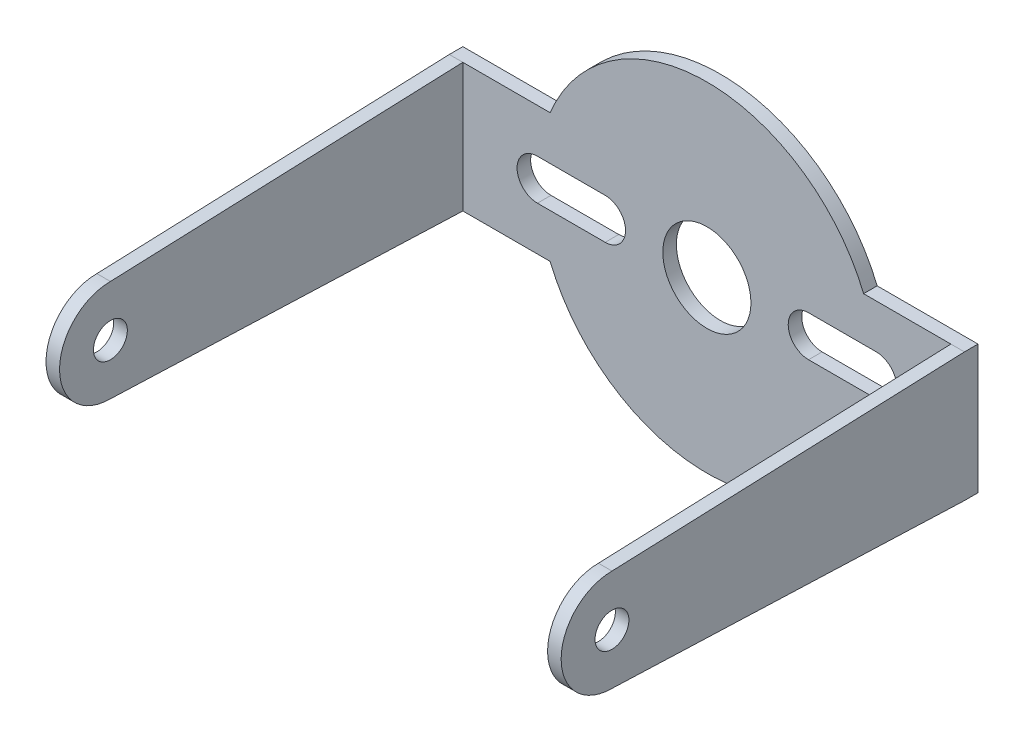
ISO-10303-21;
HEADER;
FILE_DESCRIPTION(('STEP AP214'),'2;1');
FILE_NAME('part.step','',(''),(''),'','','');
FILE_SCHEMA(('AUTOMOTIVE_DESIGN { 1 0 10303 214 1 1 1 1 }'));
ENDSEC;
DATA;
#1=APPLICATION_CONTEXT('core data for automotive mechanical design processes');
#2=APPLICATION_PROTOCOL_DEFINITION('international standard','automotive_design',2000,#1);
#3=PRODUCT_CONTEXT('',#1,'mechanical');
#4=PRODUCT('Part','Part','',(#3));
#5=PRODUCT_RELATED_PRODUCT_CATEGORY('part','',(#4));
#6=PRODUCT_DEFINITION_FORMATION('','',#4);
#7=PRODUCT_DEFINITION_CONTEXT('part definition',#1,'design');
#8=PRODUCT_DEFINITION('design','',#6,#7);
#9=PRODUCT_DEFINITION_SHAPE('','',#8);
#10=(LENGTH_UNIT() NAMED_UNIT(*) SI_UNIT(.MILLI.,.METRE.));
#11=(NAMED_UNIT(*) PLANE_ANGLE_UNIT() SI_UNIT($,.RADIAN.));
#12=(NAMED_UNIT(*) SI_UNIT($,.STERADIAN.) SOLID_ANGLE_UNIT());
#13=UNCERTAINTY_MEASURE_WITH_UNIT(LENGTH_MEASURE(1.E-05),#10,'distance_accuracy_value','');
#14=(GEOMETRIC_REPRESENTATION_CONTEXT(3) GLOBAL_UNCERTAINTY_ASSIGNED_CONTEXT((#13)) GLOBAL_UNIT_ASSIGNED_CONTEXT((#10,
#11,#12)) REPRESENTATION_CONTEXT('',''));
#15=CARTESIAN_POINT('',(0.,0.,0.));
#16=DIRECTION('',(0.,0.,1.));
#17=DIRECTION('',(1.,0.,0.));
#18=AXIS2_PLACEMENT_3D('',#15,#16,#17);
#19=CARTESIAN_POINT('',(0.,0.,1.));
#20=DIRECTION('',(0.,0.,1.));
#21=DIRECTION('',(1.,0.,0.));
#22=AXIS2_PLACEMENT_3D('',#19,#20,#21);
#23=PLANE('',#22);
#24=CARTESIAN_POINT('',(-7.5,0.,1.));
#25=DIRECTION('',(0.,0.,1.));
#26=DIRECTION('',(1.,0.,0.));
#27=AXIS2_PLACEMENT_3D('',#24,#25,#26);
#28=CIRCLE('',#27,1.49999999999999);
#29=CARTESIAN_POINT('',(-7.5,-1.5,1.));
#30=VERTEX_POINT('',#29);
#31=CARTESIAN_POINT('',(-7.5,1.49999999999999,1.));
#32=VERTEX_POINT('',#31);
#33=EDGE_CURVE('E438',#30,#32,#28,.T.);
#34=ORIENTED_EDGE('',*,*,#33,.F.);
#35=DIRECTION('',(1.,0.,0.));
#36=VECTOR('',#35,1.);
#37=CARTESIAN_POINT('',(-12.5,-1.5,1.));
#38=LINE('',#37,#36);
#39=CARTESIAN_POINT('',(-12.5,-1.49999999999999,1.));
#40=VERTEX_POINT('',#39);
#41=EDGE_CURVE('E417',#40,#30,#38,.T.);
#42=ORIENTED_EDGE('',*,*,#41,.F.);
#43=CARTESIAN_POINT('',(-12.5,0.,1.));
#44=DIRECTION('',(0.,0.,1.));
#45=DIRECTION('',(1.,0.,0.));
#46=AXIS2_PLACEMENT_3D('',#43,#44,#45);
#47=CIRCLE('',#46,1.49999999999999);
#48=CARTESIAN_POINT('',(-12.5,1.49999999999999,1.));
#49=VERTEX_POINT('',#48);
#50=EDGE_CURVE('E427',#49,#40,#47,.T.);
#51=ORIENTED_EDGE('',*,*,#50,.F.);
#52=DIRECTION('',(1.,0.,0.));
#53=VECTOR('',#52,1.);
#54=CARTESIAN_POINT('',(-12.5,1.49999999999999,1.));
#55=LINE('',#54,#53);
#56=EDGE_CURVE('E424',#49,#32,#55,.T.);
#57=ORIENTED_EDGE('',*,*,#56,.T.);
#58=EDGE_LOOP('',(#34,#42,#51,#57));
#59=FACE_BOUND('',#58,.T.);
#60=DIRECTION('',(1.,0.,0.));
#61=VECTOR('',#60,1.);
#62=CARTESIAN_POINT('',(7.5,-1.5,1.));
#63=LINE('',#62,#61);
#64=CARTESIAN_POINT('',(7.5,-1.49999999999999,1.));
#65=VERTEX_POINT('',#64);
#66=CARTESIAN_POINT('',(12.5,-1.5,1.));
#67=VERTEX_POINT('',#66);
#68=EDGE_CURVE('E449',#65,#67,#63,.T.);
#69=ORIENTED_EDGE('',*,*,#68,.F.);
#70=CARTESIAN_POINT('',(7.5,0.,1.));
#71=DIRECTION('',(0.,0.,1.));
#72=DIRECTION('',(1.,0.,0.));
#73=AXIS2_PLACEMENT_3D('',#70,#71,#72);
#74=CIRCLE('',#73,1.49999999999999);
#75=CARTESIAN_POINT('',(7.5,1.49999999999999,1.));
#76=VERTEX_POINT('',#75);
#77=EDGE_CURVE('E459',#76,#65,#74,.T.);
#78=ORIENTED_EDGE('',*,*,#77,.F.);
#79=DIRECTION('',(1.,0.,0.));
#80=VECTOR('',#79,1.);
#81=CARTESIAN_POINT('',(7.5,1.49999999999999,1.));
#82=LINE('',#81,#80);
#83=CARTESIAN_POINT('',(12.5,1.49999999999999,1.));
#84=VERTEX_POINT('',#83);
#85=EDGE_CURVE('E456',#76,#84,#82,.T.);
#86=ORIENTED_EDGE('',*,*,#85,.T.);
#87=CARTESIAN_POINT('',(12.5,0.,1.));
#88=DIRECTION('',(0.,0.,1.));
#89=DIRECTION('',(1.,0.,0.));
#90=AXIS2_PLACEMENT_3D('',#87,#88,#89);
#91=CIRCLE('',#90,1.49999999999999);
#92=EDGE_CURVE('E469',#67,#84,#91,.T.);
#93=ORIENTED_EDGE('',*,*,#92,.F.);
#94=EDGE_LOOP('',(#69,#78,#86,#93));
#95=FACE_BOUND('',#94,.T.);
#96=CARTESIAN_POINT('',(0.,0.,1.));
#97=DIRECTION('',(0.,0.,1.));
#98=DIRECTION('',(1.,0.,0.));
#99=AXIS2_PLACEMENT_3D('',#96,#97,#98);
#100=CIRCLE('',#99,3.25);
#101=CARTESIAN_POINT('',(3.25,0.,1.));
#102=VERTEX_POINT('',#101);
#103=EDGE_CURVE('E481',#102,#102,#100,.T.);
#104=ORIENTED_EDGE('',*,*,#103,.F.);
#105=EDGE_LOOP('',(#104));
#106=FACE_BOUND('',#105,.T.);
#107=DIRECTION('',(1.,0.,0.));
#108=VECTOR('',#107,1.);
#109=CARTESIAN_POINT('',(11.5623310798472,-4.75,1.));
#110=LINE('',#109,#108);
#111=CARTESIAN_POINT('',(11.5623310798472,-4.75000000000001,1.));
#112=VERTEX_POINT('',#111);
#113=CARTESIAN_POINT('',(18.,-4.75,1.));
#114=VERTEX_POINT('',#113);
#115=EDGE_CURVE('E347',#112,#114,#110,.T.);
#116=ORIENTED_EDGE('',*,*,#115,.T.);
#117=DIRECTION('',(0.,-1.,0.));
#118=VECTOR('',#117,1.);
#119=CARTESIAN_POINT('',(18.,4.75,1.));
#120=LINE('',#119,#118);
#121=CARTESIAN_POINT('',(18.,4.75,1.));
#122=VERTEX_POINT('',#121);
#123=EDGE_CURVE('E350',#122,#114,#120,.T.);
#124=ORIENTED_EDGE('',*,*,#123,.F.);
#125=DIRECTION('',(-1.,0.,0.));
#126=VECTOR('',#125,1.);
#127=CARTESIAN_POINT('',(11.5623310798472,4.75,1.));
#128=LINE('',#127,#126);
#129=CARTESIAN_POINT('',(11.5623310798472,4.75,1.));
#130=VERTEX_POINT('',#129);
#131=EDGE_CURVE('E336',#122,#130,#128,.T.);
#132=ORIENTED_EDGE('',*,*,#131,.T.);
#133=CARTESIAN_POINT('',(0.,0.,1.));
#134=DIRECTION('',(0.,0.,1.));
#135=DIRECTION('',(1.,0.,0.));
#136=AXIS2_PLACEMENT_3D('',#133,#134,#135);
#137=CIRCLE('',#136,12.5);
#138=CARTESIAN_POINT('',(-11.5623310798472,4.75,1.));
#139=VERTEX_POINT('',#138);
#140=EDGE_CURVE('E369',#130,#139,#137,.T.);
#141=ORIENTED_EDGE('',*,*,#140,.T.);
#142=DIRECTION('',(-1.,0.,0.));
#143=VECTOR('',#142,1.);
#144=CARTESIAN_POINT('',(-19.,4.75,1.));
#145=LINE('',#144,#143);
#146=CARTESIAN_POINT('',(-18.,4.75,1.));
#147=VERTEX_POINT('',#146);
#148=EDGE_CURVE('E370',#139,#147,#145,.T.);
#149=ORIENTED_EDGE('',*,*,#148,.T.);
#150=DIRECTION('',(0.,-1.,0.));
#151=VECTOR('',#150,1.);
#152=CARTESIAN_POINT('',(-18.,4.75,1.));
#153=LINE('',#152,#151);
#154=CARTESIAN_POINT('',(-18.,-4.75,1.));
#155=VERTEX_POINT('',#154);
#156=EDGE_CURVE('E388',#147,#155,#153,.T.);
#157=ORIENTED_EDGE('',*,*,#156,.T.);
#158=DIRECTION('',(1.,0.,0.));
#159=VECTOR('',#158,1.);
#160=CARTESIAN_POINT('',(-19.,-4.75,1.));
#161=LINE('',#160,#159);
#162=CARTESIAN_POINT('',(-11.5623310798472,-4.75,1.));
#163=VERTEX_POINT('',#162);
#164=EDGE_CURVE('E382',#155,#163,#161,.T.);
#165=ORIENTED_EDGE('',*,*,#164,.T.);
#166=CARTESIAN_POINT('',(0.,0.,1.));
#167=DIRECTION('',(0.,0.,1.));
#168=DIRECTION('',(1.,0.,0.));
#169=AXIS2_PLACEMENT_3D('',#166,#167,#168);
#170=CIRCLE('',#169,12.5);
#171=EDGE_CURVE('E387',#163,#112,#170,.T.);
#172=ORIENTED_EDGE('',*,*,#171,.T.);
#173=EDGE_LOOP('',(#116,#124,#132,#141,#149,#157,#165,#172));
#174=FACE_BOUND('',#173,.T.);
#175=ADVANCED_FACE('F183',(#59,#95,#106,#174),#23,.T.);
#176=CARTESIAN_POINT('',(0.,0.,0.));
#177=DIRECTION('',(0.,0.,1.));
#178=DIRECTION('',(1.,0.,0.));
#179=AXIS2_PLACEMENT_3D('',#176,#177,#178);
#180=PLANE('',#179);
#181=CARTESIAN_POINT('',(-12.5,0.,0.));
#182=DIRECTION('',(0.,0.,1.));
#183=DIRECTION('',(1.,0.,0.));
#184=AXIS2_PLACEMENT_3D('',#181,#182,#183);
#185=CIRCLE('',#184,1.5);
#186=CARTESIAN_POINT('',(-12.5,1.49999999999999,0.));
#187=VERTEX_POINT('',#186);
#188=CARTESIAN_POINT('',(-12.5,-1.5,0.));
#189=VERTEX_POINT('',#188);
#190=EDGE_CURVE('E430',#187,#189,#185,.T.);
#191=ORIENTED_EDGE('',*,*,#190,.T.);
#192=DIRECTION('',(1.,0.,0.));
#193=VECTOR('',#192,1.);
#194=CARTESIAN_POINT('',(-12.5,-1.5,0.));
#195=LINE('',#194,#193);
#196=CARTESIAN_POINT('',(-7.5,-1.5,0.));
#197=VERTEX_POINT('',#196);
#198=EDGE_CURVE('E419',#189,#197,#195,.T.);
#199=ORIENTED_EDGE('',*,*,#198,.T.);
#200=CARTESIAN_POINT('',(-7.5,0.,0.));
#201=DIRECTION('',(0.,0.,1.));
#202=DIRECTION('',(1.,0.,0.));
#203=AXIS2_PLACEMENT_3D('',#200,#201,#202);
#204=CIRCLE('',#203,1.5);
#205=CARTESIAN_POINT('',(-7.5,1.49999999999999,0.));
#206=VERTEX_POINT('',#205);
#207=EDGE_CURVE('E441',#197,#206,#204,.T.);
#208=ORIENTED_EDGE('',*,*,#207,.T.);
#209=DIRECTION('',(1.,0.,0.));
#210=VECTOR('',#209,1.);
#211=CARTESIAN_POINT('',(-12.5,1.49999999999999,0.));
#212=LINE('',#211,#210);
#213=EDGE_CURVE('E422',#187,#206,#212,.T.);
#214=ORIENTED_EDGE('',*,*,#213,.F.);
#215=EDGE_LOOP('',(#191,#199,#208,#214));
#216=FACE_BOUND('',#215,.T.);
#217=CARTESIAN_POINT('',(7.5,0.,0.));
#218=DIRECTION('',(0.,0.,1.));
#219=DIRECTION('',(1.,0.,0.));
#220=AXIS2_PLACEMENT_3D('',#217,#218,#219);
#221=CIRCLE('',#220,1.5);
#222=CARTESIAN_POINT('',(7.5,1.49999999999999,0.));
#223=VERTEX_POINT('',#222);
#224=CARTESIAN_POINT('',(7.5,-1.49999999999999,0.));
#225=VERTEX_POINT('',#224);
#226=EDGE_CURVE('E462',#223,#225,#221,.T.);
#227=ORIENTED_EDGE('',*,*,#226,.T.);
#228=DIRECTION('',(1.,0.,0.));
#229=VECTOR('',#228,1.);
#230=CARTESIAN_POINT('',(7.5,-1.5,0.));
#231=LINE('',#230,#229);
#232=CARTESIAN_POINT('',(12.5,-1.5,0.));
#233=VERTEX_POINT('',#232);
#234=EDGE_CURVE('E451',#225,#233,#231,.T.);
#235=ORIENTED_EDGE('',*,*,#234,.T.);
#236=CARTESIAN_POINT('',(12.5,0.,0.));
#237=DIRECTION('',(0.,0.,1.));
#238=DIRECTION('',(1.,0.,0.));
#239=AXIS2_PLACEMENT_3D('',#236,#237,#238);
#240=CIRCLE('',#239,1.5);
#241=CARTESIAN_POINT('',(12.5,1.49999999999999,0.));
#242=VERTEX_POINT('',#241);
#243=EDGE_CURVE('E472',#233,#242,#240,.T.);
#244=ORIENTED_EDGE('',*,*,#243,.T.);
#245=DIRECTION('',(1.,0.,0.));
#246=VECTOR('',#245,1.);
#247=CARTESIAN_POINT('',(7.5,1.49999999999999,0.));
#248=LINE('',#247,#246);
#249=EDGE_CURVE('E454',#223,#242,#248,.T.);
#250=ORIENTED_EDGE('',*,*,#249,.F.);
#251=EDGE_LOOP('',(#227,#235,#244,#250));
#252=FACE_BOUND('',#251,.T.);
#253=DIRECTION('',(1.,0.,0.));
#254=VECTOR('',#253,1.);
#255=CARTESIAN_POINT('',(11.5623310798472,-4.75,0.));
#256=LINE('',#255,#254);
#257=CARTESIAN_POINT('',(11.5623310798472,-4.75000000000001,0.));
#258=VERTEX_POINT('',#257);
#259=CARTESIAN_POINT('',(19.,-4.75,0.));
#260=VERTEX_POINT('',#259);
#261=EDGE_CURVE('E483',#258,#260,#256,.T.);
#262=ORIENTED_EDGE('',*,*,#261,.F.);
#263=CARTESIAN_POINT('',(0.,0.,0.));
#264=DIRECTION('',(0.,0.,1.));
#265=DIRECTION('',(1.,0.,0.));
#266=AXIS2_PLACEMENT_3D('',#263,#264,#265);
#267=CIRCLE('',#266,12.5);
#268=CARTESIAN_POINT('',(-11.5623310798472,-4.75,0.));
#269=VERTEX_POINT('',#268);
#270=EDGE_CURVE('E639',#269,#258,#267,.T.);
#271=ORIENTED_EDGE('',*,*,#270,.F.);
#272=DIRECTION('',(1.,0.,0.));
#273=VECTOR('',#272,1.);
#274=CARTESIAN_POINT('',(-19.,-4.75,0.));
#275=LINE('',#274,#273);
#276=CARTESIAN_POINT('',(-19.,-4.75,0.));
#277=VERTEX_POINT('',#276);
#278=EDGE_CURVE('E653',#277,#269,#275,.T.);
#279=ORIENTED_EDGE('',*,*,#278,.F.);
#280=DIRECTION('',(0.,-1.,0.));
#281=VECTOR('',#280,1.);
#282=CARTESIAN_POINT('',(-19.,4.75,0.));
#283=LINE('',#282,#281);
#284=CARTESIAN_POINT('',(-19.,4.75,0.));
#285=VERTEX_POINT('',#284);
#286=EDGE_CURVE('E651',#285,#277,#283,.T.);
#287=ORIENTED_EDGE('',*,*,#286,.F.);
#288=DIRECTION('',(-1.,0.,0.));
#289=VECTOR('',#288,1.);
#290=CARTESIAN_POINT('',(-19.,4.75,0.));
#291=LINE('',#290,#289);
#292=CARTESIAN_POINT('',(-11.5623310798472,4.75,0.));
#293=VERTEX_POINT('',#292);
#294=EDGE_CURVE('E649',#293,#285,#291,.T.);
#295=ORIENTED_EDGE('',*,*,#294,.F.);
#296=CARTESIAN_POINT('',(0.,0.,0.));
#297=DIRECTION('',(0.,0.,1.));
#298=DIRECTION('',(1.,0.,0.));
#299=AXIS2_PLACEMENT_3D('',#296,#297,#298);
#300=CIRCLE('',#299,12.5);
#301=CARTESIAN_POINT('',(11.5623310798472,4.75,0.));
#302=VERTEX_POINT('',#301);
#303=EDGE_CURVE('E647',#302,#293,#300,.T.);
#304=ORIENTED_EDGE('',*,*,#303,.F.);
#305=DIRECTION('',(-1.,0.,0.));
#306=VECTOR('',#305,1.);
#307=CARTESIAN_POINT('',(11.5623310798472,4.75,0.));
#308=LINE('',#307,#306);
#309=CARTESIAN_POINT('',(19.,4.75,0.));
#310=VERTEX_POINT('',#309);
#311=EDGE_CURVE('E643',#310,#302,#308,.T.);
#312=ORIENTED_EDGE('',*,*,#311,.F.);
#313=DIRECTION('',(0.,1.,0.));
#314=VECTOR('',#313,1.);
#315=CARTESIAN_POINT('',(19.,4.75,0.));
#316=LINE('',#315,#314);
#317=EDGE_CURVE('E539',#260,#310,#316,.T.);
#318=ORIENTED_EDGE('',*,*,#317,.F.);
#319=EDGE_LOOP('',(#262,#271,#279,#287,#295,#304,#312,#318));
#320=FACE_BOUND('',#319,.T.);
#321=CARTESIAN_POINT('',(0.,0.,0.));
#322=DIRECTION('',(0.,0.,1.));
#323=DIRECTION('',(1.,0.,0.));
#324=AXIS2_PLACEMENT_3D('',#321,#322,#323);
#325=CIRCLE('',#324,3.25);
#326=CARTESIAN_POINT('',(3.25,0.,0.));
#327=VERTEX_POINT('',#326);
#328=EDGE_CURVE('E480',#327,#327,#325,.T.);
#329=ORIENTED_EDGE('',*,*,#328,.T.);
#330=EDGE_LOOP('',(#329));
#331=FACE_BOUND('',#330,.T.);
#332=ADVANCED_FACE('F487',(#216,#252,#320,#331),#180,.F.);
#333=CARTESIAN_POINT('',(11.5623310798472,-4.75,1.));
#334=DIRECTION('',(0.,1.,0.));
#335=DIRECTION('',(0.,0.,1.));
#336=AXIS2_PLACEMENT_3D('',#333,#334,#335);
#337=PLANE('',#336);
#338=ORIENTED_EDGE('',*,*,#261,.T.);
#339=DIRECTION('',(0.,0.,-1.));
#340=VECTOR('',#339,1.);
#341=CARTESIAN_POINT('',(19.,-4.75,1.));
#342=LINE('',#341,#340);
#343=CARTESIAN_POINT('',(19.,-4.75,1.));
#344=VERTEX_POINT('',#343);
#345=EDGE_CURVE('E13',#344,#260,#342,.T.);
#346=ORIENTED_EDGE('',*,*,#345,.F.);
#347=DIRECTION('',(1.,0.,0.));
#348=VECTOR('',#347,1.);
#349=CARTESIAN_POINT('',(18.,-4.75,1.));
#350=LINE('',#349,#348);
#351=EDGE_CURVE('E200',#114,#344,#350,.T.);
#352=ORIENTED_EDGE('',*,*,#351,.F.);
#353=ORIENTED_EDGE('',*,*,#115,.F.);
#354=DIRECTION('',(0.,0.,-1.));
#355=VECTOR('',#354,1.);
#356=CARTESIAN_POINT('',(11.5623310798472,-4.75000000000001,1.));
#357=LINE('',#356,#355);
#358=EDGE_CURVE('E656',#112,#258,#357,.T.);
#359=ORIENTED_EDGE('',*,*,#358,.T.);
#360=EDGE_LOOP('',(#338,#346,#352,#353,#359));
#361=FACE_BOUND('',#360,.T.);
#362=ADVANCED_FACE('F185',(#361),#337,.F.);
#363=CARTESIAN_POINT('',(19.,4.75,1.));
#364=DIRECTION('',(-1.,0.,0.));
#365=DIRECTION('',(0.,0.,1.));
#366=AXIS2_PLACEMENT_3D('',#363,#364,#365);
#367=PLANE('',#366);
#368=ORIENTED_EDGE('',*,*,#317,.T.);
#369=DIRECTION('',(0.,0.,-1.));
#370=VECTOR('',#369,1.);
#371=CARTESIAN_POINT('',(19.,4.75,1.));
#372=LINE('',#371,#370);
#373=CARTESIAN_POINT('',(19.,4.75,1.));
#374=VERTEX_POINT('',#373);
#375=EDGE_CURVE('E192',#374,#310,#372,.T.);
#376=ORIENTED_EDGE('',*,*,#375,.F.);
#377=DIRECTION('',(0.,0.0384331221012044,-0.999261174631314));
#378=VECTOR('',#377,1.);
#379=CARTESIAN_POINT('',(19.,4.75,1.));
#380=LINE('',#379,#378);
#381=CARTESIAN_POINT('',(19.,3.75,27.));
#382=VERTEX_POINT('',#381);
#383=EDGE_CURVE('E368',#382,#374,#380,.T.);
#384=ORIENTED_EDGE('',*,*,#383,.F.);
#385=CARTESIAN_POINT('',(19.,0.,27.));
#386=DIRECTION('',(-1.,0.,0.));
#387=DIRECTION('',(0.,0.,1.));
#388=AXIS2_PLACEMENT_3D('',#385,#386,#387);
#389=CIRCLE('',#388,3.75);
#390=CARTESIAN_POINT('',(19.,-3.75,27.));
#391=VERTEX_POINT('',#390);
#392=EDGE_CURVE('E554',#391,#382,#389,.T.);
#393=ORIENTED_EDGE('',*,*,#392,.F.);
#394=DIRECTION('',(0.,0.0384331221012044,0.999261174631314));
#395=VECTOR('',#394,1.);
#396=CARTESIAN_POINT('',(19.,-4.75,1.));
#397=LINE('',#396,#395);
#398=EDGE_CURVE('E355',#344,#391,#397,.T.);
#399=ORIENTED_EDGE('',*,*,#398,.F.);
#400=ORIENTED_EDGE('',*,*,#345,.T.);
#401=EDGE_LOOP('',(#368,#376,#384,#393,#399,#400));
#402=FACE_BOUND('',#401,.T.);
#403=CARTESIAN_POINT('',(19.,0.,27.));
#404=DIRECTION('',(-1.,0.,0.));
#405=DIRECTION('',(0.,0.,1.));
#406=AXIS2_PLACEMENT_3D('',#403,#404,#405);
#407=CIRCLE('',#406,1.25);
#408=CARTESIAN_POINT('',(19.,0.,28.25));
#409=VERTEX_POINT('',#408);
#410=EDGE_CURVE('E542',#409,#409,#407,.T.);
#411=ORIENTED_EDGE('',*,*,#410,.T.);
#412=EDGE_LOOP('',(#411));
#413=FACE_BOUND('',#412,.T.);
#414=ADVANCED_FACE('F532',(#402,#413),#367,.F.);
#415=CARTESIAN_POINT('',(11.5623310798472,4.75,1.));
#416=DIRECTION('',(0.,-1.,0.));
#417=DIRECTION('',(0.,0.,-1.));
#418=AXIS2_PLACEMENT_3D('',#415,#416,#417);
#419=PLANE('',#418);
#420=ORIENTED_EDGE('',*,*,#311,.T.);
#421=DIRECTION('',(0.,0.,-1.));
#422=VECTOR('',#421,1.);
#423=CARTESIAN_POINT('',(11.5623310798472,4.75,1.));
#424=LINE('',#423,#422);
#425=EDGE_CURVE('E344',#130,#302,#424,.T.);
#426=ORIENTED_EDGE('',*,*,#425,.F.);
#427=ORIENTED_EDGE('',*,*,#131,.F.);
#428=EDGE_CURVE('E341',#374,#122,#128,.T.);
#429=ORIENTED_EDGE('',*,*,#428,.F.);
#430=ORIENTED_EDGE('',*,*,#375,.T.);
#431=EDGE_LOOP('',(#420,#426,#427,#429,#430));
#432=FACE_BOUND('',#431,.T.);
#433=ADVANCED_FACE('F338',(#432),#419,.F.);
#434=CARTESIAN_POINT('',(0.,0.,1.));
#435=DIRECTION('',(0.,0.,-1.));
#436=DIRECTION('',(-1.,0.,0.));
#437=AXIS2_PLACEMENT_3D('',#434,#435,#436);
#438=CYLINDRICAL_SURFACE('',#437,12.5);
#439=ORIENTED_EDGE('',*,*,#303,.T.);
#440=DIRECTION('',(0.,0.,-1.));
#441=VECTOR('',#440,1.);
#442=CARTESIAN_POINT('',(-11.5623310798472,4.75,1.));
#443=LINE('',#442,#441);
#444=EDGE_CURVE('E667',#139,#293,#443,.T.);
#445=ORIENTED_EDGE('',*,*,#444,.F.);
#446=ORIENTED_EDGE('',*,*,#140,.F.);
#447=ORIENTED_EDGE('',*,*,#425,.T.);
#448=EDGE_LOOP('',(#439,#445,#446,#447));
#449=FACE_BOUND('',#448,.T.);
#450=ADVANCED_FACE('F526',(#449),#438,.T.);
#451=CARTESIAN_POINT('',(-19.,4.75,1.));
#452=DIRECTION('',(0.,-1.,0.));
#453=DIRECTION('',(0.,0.,-1.));
#454=AXIS2_PLACEMENT_3D('',#451,#452,#453);
#455=PLANE('',#454);
#456=ORIENTED_EDGE('',*,*,#294,.T.);
#457=DIRECTION('',(0.,0.,-1.));
#458=VECTOR('',#457,1.);
#459=CARTESIAN_POINT('',(-19.,4.75,1.));
#460=LINE('',#459,#458);
#461=CARTESIAN_POINT('',(-19.,4.75,1.));
#462=VERTEX_POINT('',#461);
#463=EDGE_CURVE('E664',#462,#285,#460,.T.);
#464=ORIENTED_EDGE('',*,*,#463,.F.);
#465=DIRECTION('',(-1.,0.,0.));
#466=VECTOR('',#465,1.);
#467=CARTESIAN_POINT('',(-18.,4.75,1.));
#468=LINE('',#467,#466);
#469=EDGE_CURVE('E414',#147,#462,#468,.T.);
#470=ORIENTED_EDGE('',*,*,#469,.F.);
#471=ORIENTED_EDGE('',*,*,#148,.F.);
#472=ORIENTED_EDGE('',*,*,#444,.T.);
#473=EDGE_LOOP('',(#456,#464,#470,#471,#472));
#474=FACE_BOUND('',#473,.T.);
#475=ADVANCED_FACE('F522',(#474),#455,.F.);
#476=CARTESIAN_POINT('',(-19.,4.75,1.));
#477=DIRECTION('',(1.,0.,0.));
#478=DIRECTION('',(0.,0.,-1.));
#479=AXIS2_PLACEMENT_3D('',#476,#477,#478);
#480=PLANE('',#479);
#481=ORIENTED_EDGE('',*,*,#286,.T.);
#482=DIRECTION('',(0.,0.,-1.));
#483=VECTOR('',#482,1.);
#484=CARTESIAN_POINT('',(-19.,-4.75,1.));
#485=LINE('',#484,#483);
#486=CARTESIAN_POINT('',(-19.,-4.75,1.));
#487=VERTEX_POINT('',#486);
#488=EDGE_CURVE('E661',#487,#277,#485,.T.);
#489=ORIENTED_EDGE('',*,*,#488,.F.);
#490=DIRECTION('',(0.,0.0384331221012044,0.999261174631314));
#491=VECTOR('',#490,1.);
#492=CARTESIAN_POINT('',(-19.,-4.75,1.));
#493=LINE('',#492,#491);
#494=CARTESIAN_POINT('',(-19.,-3.75,27.));
#495=VERTEX_POINT('',#494);
#496=EDGE_CURVE('E403',#487,#495,#493,.T.);
#497=ORIENTED_EDGE('',*,*,#496,.T.);
#498=CARTESIAN_POINT('',(-19.,0.,27.));
#499=DIRECTION('',(-1.,0.,0.));
#500=DIRECTION('',(0.,0.,1.));
#501=AXIS2_PLACEMENT_3D('',#498,#499,#500);
#502=CIRCLE('',#501,3.75);
#503=CARTESIAN_POINT('',(-19.,3.75,27.));
#504=VERTEX_POINT('',#503);
#505=EDGE_CURVE('E406',#495,#504,#502,.T.);
#506=ORIENTED_EDGE('',*,*,#505,.T.);
#507=DIRECTION('',(0.,0.0384331221012044,-0.999261174631314));
#508=VECTOR('',#507,1.);
#509=CARTESIAN_POINT('',(-19.,4.75,1.));
#510=LINE('',#509,#508);
#511=EDGE_CURVE('E392',#504,#462,#510,.T.);
#512=ORIENTED_EDGE('',*,*,#511,.T.);
#513=ORIENTED_EDGE('',*,*,#463,.T.);
#514=EDGE_LOOP('',(#481,#489,#497,#506,#512,#513));
#515=FACE_BOUND('',#514,.T.);
#516=CARTESIAN_POINT('',(-19.,0.,27.));
#517=DIRECTION('',(-1.,0.,0.));
#518=DIRECTION('',(0.,0.,1.));
#519=AXIS2_PLACEMENT_3D('',#516,#517,#518);
#520=CIRCLE('',#519,1.25);
#521=CARTESIAN_POINT('',(-19.,0.,28.25));
#522=VERTEX_POINT('',#521);
#523=EDGE_CURVE('E397',#522,#522,#520,.T.);
#524=ORIENTED_EDGE('',*,*,#523,.F.);
#525=EDGE_LOOP('',(#524));
#526=FACE_BOUND('',#525,.T.);
#527=ADVANCED_FACE('F518',(#515,#526),#480,.F.);
#528=CARTESIAN_POINT('',(-19.,-4.75,1.));
#529=DIRECTION('',(0.,1.,0.));
#530=DIRECTION('',(0.,0.,1.));
#531=AXIS2_PLACEMENT_3D('',#528,#529,#530);
#532=PLANE('',#531);
#533=ORIENTED_EDGE('',*,*,#278,.T.);
#534=DIRECTION('',(0.,0.,-1.));
#535=VECTOR('',#534,1.);
#536=CARTESIAN_POINT('',(-11.5623310798472,-4.75,1.));
#537=LINE('',#536,#535);
#538=EDGE_CURVE('E658',#163,#269,#537,.T.);
#539=ORIENTED_EDGE('',*,*,#538,.F.);
#540=ORIENTED_EDGE('',*,*,#164,.F.);
#541=EDGE_CURVE('E385',#487,#155,#161,.T.);
#542=ORIENTED_EDGE('',*,*,#541,.F.);
#543=ORIENTED_EDGE('',*,*,#488,.T.);
#544=EDGE_LOOP('',(#533,#539,#540,#542,#543));
#545=FACE_BOUND('',#544,.T.);
#546=ADVANCED_FACE('F502',(#545),#532,.F.);
#547=CARTESIAN_POINT('',(0.,0.,1.));
#548=DIRECTION('',(0.,0.,-1.));
#549=DIRECTION('',(-1.,0.,0.));
#550=AXIS2_PLACEMENT_3D('',#547,#548,#549);
#551=CYLINDRICAL_SURFACE('',#550,12.5);
#552=ORIENTED_EDGE('',*,*,#270,.T.);
#553=ORIENTED_EDGE('',*,*,#358,.F.);
#554=ORIENTED_EDGE('',*,*,#171,.F.);
#555=ORIENTED_EDGE('',*,*,#538,.T.);
#556=EDGE_LOOP('',(#552,#553,#554,#555));
#557=FACE_BOUND('',#556,.T.);
#558=ADVANCED_FACE('F492',(#557),#551,.T.);
#559=CARTESIAN_POINT('',(0.,0.,1.));
#560=DIRECTION('',(0.,0.,-1.));
#561=DIRECTION('',(-1.,0.,0.));
#562=AXIS2_PLACEMENT_3D('',#559,#560,#561);
#563=CYLINDRICAL_SURFACE('',#562,3.25);
#564=ORIENTED_EDGE('',*,*,#103,.T.);
#565=EDGE_LOOP('',(#564));
#566=FACE_BOUND('',#565,.T.);
#567=ORIENTED_EDGE('',*,*,#328,.F.);
#568=EDGE_LOOP('',(#567));
#569=FACE_BOUND('',#568,.T.);
#570=ADVANCED_FACE('F489',(#566,#569),#563,.F.);
#571=CARTESIAN_POINT('',(12.5,0.,1.));
#572=DIRECTION('',(0.,0.,1.));
#573=DIRECTION('',(1.,0.,0.));
#574=AXIS2_PLACEMENT_3D('',#571,#572,#573);
#575=CYLINDRICAL_SURFACE('',#574,1.49999999999999);
#576=ORIENTED_EDGE('',*,*,#243,.F.);
#577=DIRECTION('',(0.,0.,1.));
#578=VECTOR('',#577,1.);
#579=CARTESIAN_POINT('',(12.5,-1.49999999999999,1.));
#580=LINE('',#579,#578);
#581=EDGE_CURVE('E477',#67,#233,#580,.F.);
#582=ORIENTED_EDGE('',*,*,#581,.F.);
#583=ORIENTED_EDGE('',*,*,#92,.T.);
#584=DIRECTION('',(0.,0.,1.));
#585=VECTOR('',#584,1.);
#586=CARTESIAN_POINT('',(12.5,1.49999999999999,1.));
#587=LINE('',#586,#585);
#588=EDGE_CURVE('E475',#242,#84,#587,.T.);
#589=ORIENTED_EDGE('',*,*,#588,.F.);
#590=EDGE_LOOP('',(#576,#582,#583,#589));
#591=FACE_BOUND('',#590,.T.);
#592=ADVANCED_FACE('F491',(#591),#575,.F.);
#593=CARTESIAN_POINT('',(7.5,0.,1.));
#594=DIRECTION('',(0.,0.,1.));
#595=DIRECTION('',(1.,0.,0.));
#596=AXIS2_PLACEMENT_3D('',#593,#594,#595);
#597=CYLINDRICAL_SURFACE('',#596,1.49999999999999);
#598=ORIENTED_EDGE('',*,*,#77,.T.);
#599=DIRECTION('',(0.,0.,1.));
#600=VECTOR('',#599,1.);
#601=CARTESIAN_POINT('',(7.5,-1.49999999999999,1.));
#602=LINE('',#601,#600);
#603=EDGE_CURVE('E465',#225,#65,#602,.T.);
#604=ORIENTED_EDGE('',*,*,#603,.F.);
#605=ORIENTED_EDGE('',*,*,#226,.F.);
#606=DIRECTION('',(0.,0.,1.));
#607=VECTOR('',#606,1.);
#608=CARTESIAN_POINT('',(7.5,1.49999999999999,1.));
#609=LINE('',#608,#607);
#610=EDGE_CURVE('E467',#76,#223,#609,.F.);
#611=ORIENTED_EDGE('',*,*,#610,.F.);
#612=EDGE_LOOP('',(#598,#604,#605,#611));
#613=FACE_BOUND('',#612,.T.);
#614=ADVANCED_FACE('F499',(#613),#597,.F.);
#615=CARTESIAN_POINT('',(7.5,1.49999999999999,1.));
#616=DIRECTION('',(0.,1.,0.));
#617=DIRECTION('',(-1.,0.,0.));
#618=AXIS2_PLACEMENT_3D('',#615,#616,#617);
#619=PLANE('',#618);
#620=ORIENTED_EDGE('',*,*,#588,.T.);
#621=ORIENTED_EDGE('',*,*,#85,.F.);
#622=ORIENTED_EDGE('',*,*,#610,.T.);
#623=ORIENTED_EDGE('',*,*,#249,.T.);
#624=EDGE_LOOP('',(#620,#621,#622,#623));
#625=FACE_BOUND('',#624,.T.);
#626=ADVANCED_FACE('F614',(#625),#619,.F.);
#627=CARTESIAN_POINT('',(7.5,-1.49999999999999,1.));
#628=DIRECTION('',(0.,-1.,0.));
#629=DIRECTION('',(1.,0.,0.));
#630=AXIS2_PLACEMENT_3D('',#627,#628,#629);
#631=PLANE('',#630);
#632=ORIENTED_EDGE('',*,*,#581,.T.);
#633=ORIENTED_EDGE('',*,*,#234,.F.);
#634=ORIENTED_EDGE('',*,*,#603,.T.);
#635=ORIENTED_EDGE('',*,*,#68,.T.);
#636=EDGE_LOOP('',(#632,#633,#634,#635));
#637=FACE_BOUND('',#636,.T.);
#638=ADVANCED_FACE('F610',(#637),#631,.F.);
#639=CARTESIAN_POINT('',(-7.5,0.,1.));
#640=DIRECTION('',(0.,0.,1.));
#641=DIRECTION('',(1.,0.,0.));
#642=AXIS2_PLACEMENT_3D('',#639,#640,#641);
#643=CYLINDRICAL_SURFACE('',#642,1.49999999999999);
#644=ORIENTED_EDGE('',*,*,#207,.F.);
#645=DIRECTION('',(0.,0.,1.));
#646=VECTOR('',#645,1.);
#647=CARTESIAN_POINT('',(-7.5,-1.49999999999999,1.));
#648=LINE('',#647,#646);
#649=EDGE_CURVE('E446',#30,#197,#648,.F.);
#650=ORIENTED_EDGE('',*,*,#649,.F.);
#651=ORIENTED_EDGE('',*,*,#33,.T.);
#652=DIRECTION('',(0.,0.,1.));
#653=VECTOR('',#652,1.);
#654=CARTESIAN_POINT('',(-7.5,1.49999999999999,1.));
#655=LINE('',#654,#653);
#656=EDGE_CURVE('E444',#206,#32,#655,.T.);
#657=ORIENTED_EDGE('',*,*,#656,.F.);
#658=EDGE_LOOP('',(#644,#650,#651,#657));
#659=FACE_BOUND('',#658,.T.);
#660=ADVANCED_FACE('F606',(#659),#643,.F.);
#661=CARTESIAN_POINT('',(-12.5,0.,1.));
#662=DIRECTION('',(0.,0.,1.));
#663=DIRECTION('',(1.,0.,0.));
#664=AXIS2_PLACEMENT_3D('',#661,#662,#663);
#665=CYLINDRICAL_SURFACE('',#664,1.49999999999999);
#666=ORIENTED_EDGE('',*,*,#50,.T.);
#667=DIRECTION('',(0.,0.,1.));
#668=VECTOR('',#667,1.);
#669=CARTESIAN_POINT('',(-12.5,-1.49999999999999,1.));
#670=LINE('',#669,#668);
#671=EDGE_CURVE('E433',#189,#40,#670,.T.);
#672=ORIENTED_EDGE('',*,*,#671,.F.);
#673=ORIENTED_EDGE('',*,*,#190,.F.);
#674=DIRECTION('',(0.,0.,1.));
#675=VECTOR('',#674,1.);
#676=CARTESIAN_POINT('',(-12.5,1.49999999999999,1.));
#677=LINE('',#676,#675);
#678=EDGE_CURVE('E435',#49,#187,#677,.F.);
#679=ORIENTED_EDGE('',*,*,#678,.F.);
#680=EDGE_LOOP('',(#666,#672,#673,#679));
#681=FACE_BOUND('',#680,.T.);
#682=ADVANCED_FACE('F602',(#681),#665,.F.);
#683=CARTESIAN_POINT('',(-12.5,1.49999999999999,1.));
#684=DIRECTION('',(0.,1.,0.));
#685=DIRECTION('',(-1.,0.,0.));
#686=AXIS2_PLACEMENT_3D('',#683,#684,#685);
#687=PLANE('',#686);
#688=ORIENTED_EDGE('',*,*,#656,.T.);
#689=ORIENTED_EDGE('',*,*,#56,.F.);
#690=ORIENTED_EDGE('',*,*,#678,.T.);
#691=ORIENTED_EDGE('',*,*,#213,.T.);
#692=EDGE_LOOP('',(#688,#689,#690,#691));
#693=FACE_BOUND('',#692,.T.);
#694=ADVANCED_FACE('F598',(#693),#687,.F.);
#695=CARTESIAN_POINT('',(-12.5,-1.49999999999999,1.));
#696=DIRECTION('',(0.,-1.,0.));
#697=DIRECTION('',(1.,0.,0.));
#698=AXIS2_PLACEMENT_3D('',#695,#696,#697);
#699=PLANE('',#698);
#700=ORIENTED_EDGE('',*,*,#649,.T.);
#701=ORIENTED_EDGE('',*,*,#198,.F.);
#702=ORIENTED_EDGE('',*,*,#671,.T.);
#703=ORIENTED_EDGE('',*,*,#41,.T.);
#704=EDGE_LOOP('',(#700,#701,#702,#703));
#705=FACE_BOUND('',#704,.T.);
#706=ADVANCED_FACE('F588',(#705),#699,.F.);
#707=CARTESIAN_POINT('',(-18.,4.75,1.));
#708=DIRECTION('',(0.,0.999261174631314,0.0384331221012044));
#709=DIRECTION('',(0.,-0.0384331221012044,0.999261174631314));
#710=AXIS2_PLACEMENT_3D('',#707,#708,#709);
#711=PLANE('',#710);
#712=ORIENTED_EDGE('',*,*,#511,.F.);
#713=DIRECTION('',(-1.,0.,0.));
#714=VECTOR('',#713,1.);
#715=CARTESIAN_POINT('',(-18.,3.75,27.));
#716=LINE('',#715,#714);
#717=CARTESIAN_POINT('',(-18.,3.75,27.));
#718=VERTEX_POINT('',#717);
#719=EDGE_CURVE('E412',#718,#504,#716,.T.);
#720=ORIENTED_EDGE('',*,*,#719,.F.);
#721=DIRECTION('',(0.,0.0384331221012044,-0.999261174631314));
#722=VECTOR('',#721,1.);
#723=CARTESIAN_POINT('',(-18.,4.75,1.));
#724=LINE('',#723,#722);
#725=EDGE_CURVE('E402',#718,#147,#724,.T.);
#726=ORIENTED_EDGE('',*,*,#725,.T.);
#727=ORIENTED_EDGE('',*,*,#469,.T.);
#728=EDGE_LOOP('',(#712,#720,#726,#727));
#729=FACE_BOUND('',#728,.T.);
#730=ADVANCED_FACE('F584',(#729),#711,.T.);
#731=CARTESIAN_POINT('',(-18.,0.,27.));
#732=DIRECTION('',(-1.,0.,0.));
#733=DIRECTION('',(0.,0.,1.));
#734=AXIS2_PLACEMENT_3D('',#731,#732,#733);
#735=CYLINDRICAL_SURFACE('',#734,3.75);
#736=ORIENTED_EDGE('',*,*,#505,.F.);
#737=DIRECTION('',(-1.,0.,0.));
#738=VECTOR('',#737,1.);
#739=CARTESIAN_POINT('',(-18.,-3.75,27.));
#740=LINE('',#739,#738);
#741=CARTESIAN_POINT('',(-18.,-3.75,27.));
#742=VERTEX_POINT('',#741);
#743=EDGE_CURVE('E415',#742,#495,#740,.T.);
#744=ORIENTED_EDGE('',*,*,#743,.F.);
#745=CARTESIAN_POINT('',(-18.,0.,27.));
#746=DIRECTION('',(-1.,0.,0.));
#747=DIRECTION('',(0.,0.,1.));
#748=AXIS2_PLACEMENT_3D('',#745,#746,#747);
#749=CIRCLE('',#748,3.75);
#750=EDGE_CURVE('E399',#742,#718,#749,.T.);
#751=ORIENTED_EDGE('',*,*,#750,.T.);
#752=ORIENTED_EDGE('',*,*,#719,.T.);
#753=EDGE_LOOP('',(#736,#744,#751,#752));
#754=FACE_BOUND('',#753,.T.);
#755=ADVANCED_FACE('F587',(#754),#735,.T.);
#756=CARTESIAN_POINT('',(-18.,-4.75,1.));
#757=DIRECTION('',(0.,-0.999261174631314,0.0384331221012044));
#758=DIRECTION('',(0.,-0.0384331221012044,-0.999261174631314));
#759=AXIS2_PLACEMENT_3D('',#756,#757,#758);
#760=PLANE('',#759);
#761=ORIENTED_EDGE('',*,*,#496,.F.);
#762=ORIENTED_EDGE('',*,*,#541,.T.);
#763=DIRECTION('',(0.,0.0384331221012044,0.999261174631314));
#764=VECTOR('',#763,1.);
#765=CARTESIAN_POINT('',(-18.,-4.75,1.));
#766=LINE('',#765,#764);
#767=EDGE_CURVE('E208',#155,#742,#766,.T.);
#768=ORIENTED_EDGE('',*,*,#767,.T.);
#769=ORIENTED_EDGE('',*,*,#743,.T.);
#770=EDGE_LOOP('',(#761,#762,#768,#769));
#771=FACE_BOUND('',#770,.T.);
#772=ADVANCED_FACE('F579',(#771),#760,.T.);
#773=CARTESIAN_POINT('',(-18.,0.,27.));
#774=DIRECTION('',(-1.,0.,0.));
#775=DIRECTION('',(0.,0.,1.));
#776=AXIS2_PLACEMENT_3D('',#773,#774,#775);
#777=PLANE('',#776);
#778=CARTESIAN_POINT('',(-18.,0.,27.));
#779=DIRECTION('',(-1.,0.,0.));
#780=DIRECTION('',(0.,0.,1.));
#781=AXIS2_PLACEMENT_3D('',#778,#779,#780);
#782=CIRCLE('',#781,1.25);
#783=CARTESIAN_POINT('',(-18.,0.,28.25));
#784=VERTEX_POINT('',#783);
#785=EDGE_CURVE('E407',#784,#784,#782,.T.);
#786=ORIENTED_EDGE('',*,*,#785,.T.);
#787=EDGE_LOOP('',(#786));
#788=FACE_BOUND('',#787,.T.);
#789=ORIENTED_EDGE('',*,*,#156,.F.);
#790=ORIENTED_EDGE('',*,*,#725,.F.);
#791=ORIENTED_EDGE('',*,*,#750,.F.);
#792=ORIENTED_EDGE('',*,*,#767,.F.);
#793=EDGE_LOOP('',(#789,#790,#791,#792));
#794=FACE_BOUND('',#793,.T.);
#795=ADVANCED_FACE('F570',(#788,#794),#777,.F.);
#796=CARTESIAN_POINT('',(-18.,0.,27.));
#797=DIRECTION('',(-1.,0.,0.));
#798=DIRECTION('',(0.,0.,1.));
#799=AXIS2_PLACEMENT_3D('',#796,#797,#798);
#800=CYLINDRICAL_SURFACE('',#799,1.25);
#801=ORIENTED_EDGE('',*,*,#785,.F.);
#802=EDGE_LOOP('',(#801));
#803=FACE_BOUND('',#802,.T.);
#804=ORIENTED_EDGE('',*,*,#523,.T.);
#805=EDGE_LOOP('',(#804));
#806=FACE_BOUND('',#805,.T.);
#807=ADVANCED_FACE('F567',(#803,#806),#800,.F.);
#808=CARTESIAN_POINT('',(18.,0.,27.));
#809=DIRECTION('',(1.,0.,0.));
#810=DIRECTION('',(0.,0.,1.));
#811=AXIS2_PLACEMENT_3D('',#808,#809,#810);
#812=PLANE('',#811);
#813=ORIENTED_EDGE('',*,*,#123,.T.);
#814=DIRECTION('',(0.,0.0384331221012044,0.999261174631314));
#815=VECTOR('',#814,1.);
#816=CARTESIAN_POINT('',(18.,-4.75,1.));
#817=LINE('',#816,#815);
#818=CARTESIAN_POINT('',(18.,-3.75,27.));
#819=VERTEX_POINT('',#818);
#820=EDGE_CURVE('E550',#114,#819,#817,.T.);
#821=ORIENTED_EDGE('',*,*,#820,.T.);
#822=CARTESIAN_POINT('',(18.,0.,27.));
#823=DIRECTION('',(-1.,0.,0.));
#824=DIRECTION('',(0.,0.,1.));
#825=AXIS2_PLACEMENT_3D('',#822,#823,#824);
#826=CIRCLE('',#825,3.75);
#827=CARTESIAN_POINT('',(18.,3.75,27.));
#828=VERTEX_POINT('',#827);
#829=EDGE_CURVE('E361',#819,#828,#826,.T.);
#830=ORIENTED_EDGE('',*,*,#829,.T.);
#831=DIRECTION('',(0.,0.0384331221012044,-0.999261174631314));
#832=VECTOR('',#831,1.);
#833=CARTESIAN_POINT('',(18.,4.75,1.));
#834=LINE('',#833,#832);
#835=EDGE_CURVE('E354',#828,#122,#834,.T.);
#836=ORIENTED_EDGE('',*,*,#835,.T.);
#837=EDGE_LOOP('',(#813,#821,#830,#836));
#838=FACE_BOUND('',#837,.T.);
#839=CARTESIAN_POINT('',(18.,0.,27.));
#840=DIRECTION('',(-1.,0.,0.));
#841=DIRECTION('',(0.,0.,1.));
#842=AXIS2_PLACEMENT_3D('',#839,#840,#841);
#843=CIRCLE('',#842,1.25);
#844=CARTESIAN_POINT('',(18.,0.,28.25));
#845=VERTEX_POINT('',#844);
#846=EDGE_CURVE('E544',#845,#845,#843,.T.);
#847=ORIENTED_EDGE('',*,*,#846,.F.);
#848=EDGE_LOOP('',(#847));
#849=FACE_BOUND('',#848,.T.);
#850=ADVANCED_FACE('F358',(#838,#849),#812,.F.);
#851=CARTESIAN_POINT('',(18.,-4.75,1.));
#852=DIRECTION('',(0.,0.999261174631314,-0.0384331221012044));
#853=DIRECTION('',(0.,0.0384331221012044,0.999261174631314));
#854=AXIS2_PLACEMENT_3D('',#851,#852,#853);
#855=PLANE('',#854);
#856=ORIENTED_EDGE('',*,*,#398,.T.);
#857=DIRECTION('',(1.,0.,0.));
#858=VECTOR('',#857,1.);
#859=CARTESIAN_POINT('',(18.,-3.75,27.));
#860=LINE('',#859,#858);
#861=EDGE_CURVE('E558',#819,#391,#860,.T.);
#862=ORIENTED_EDGE('',*,*,#861,.F.);
#863=ORIENTED_EDGE('',*,*,#820,.F.);
#864=ORIENTED_EDGE('',*,*,#351,.T.);
#865=EDGE_LOOP('',(#856,#862,#863,#864));
#866=FACE_BOUND('',#865,.T.);
#867=ADVANCED_FACE('F577',(#866),#855,.F.);
#868=CARTESIAN_POINT('',(18.,0.,27.));
#869=DIRECTION('',(1.,0.,0.));
#870=DIRECTION('',(0.,0.,-1.));
#871=AXIS2_PLACEMENT_3D('',#868,#869,#870);
#872=CYLINDRICAL_SURFACE('',#871,3.75);
#873=ORIENTED_EDGE('',*,*,#392,.T.);
#874=DIRECTION('',(1.,0.,0.));
#875=VECTOR('',#874,1.);
#876=CARTESIAN_POINT('',(18.,3.75,27.));
#877=LINE('',#876,#875);
#878=EDGE_CURVE('E552',#828,#382,#877,.T.);
#879=ORIENTED_EDGE('',*,*,#878,.F.);
#880=ORIENTED_EDGE('',*,*,#829,.F.);
#881=ORIENTED_EDGE('',*,*,#861,.T.);
#882=EDGE_LOOP('',(#873,#879,#880,#881));
#883=FACE_BOUND('',#882,.T.);
#884=ADVANCED_FACE('F694',(#883),#872,.T.);
#885=CARTESIAN_POINT('',(18.,4.75,1.));
#886=DIRECTION('',(0.,-0.999261174631314,-0.0384331221012044));
#887=DIRECTION('',(0.,0.0384331221012044,-0.999261174631314));
#888=AXIS2_PLACEMENT_3D('',#885,#886,#887);
#889=PLANE('',#888);
#890=ORIENTED_EDGE('',*,*,#383,.T.);
#891=ORIENTED_EDGE('',*,*,#428,.T.);
#892=ORIENTED_EDGE('',*,*,#835,.F.);
#893=ORIENTED_EDGE('',*,*,#878,.T.);
#894=EDGE_LOOP('',(#890,#891,#892,#893));
#895=FACE_BOUND('',#894,.T.);
#896=ADVANCED_FACE('F366',(#895),#889,.F.);
#897=CARTESIAN_POINT('',(18.,0.,27.));
#898=DIRECTION('',(1.,0.,0.));
#899=DIRECTION('',(0.,0.,-1.));
#900=AXIS2_PLACEMENT_3D('',#897,#898,#899);
#901=CYLINDRICAL_SURFACE('',#900,1.25);
#902=ORIENTED_EDGE('',*,*,#846,.T.);
#903=EDGE_LOOP('',(#902));
#904=FACE_BOUND('',#903,.T.);
#905=ORIENTED_EDGE('',*,*,#410,.F.);
#906=EDGE_LOOP('',(#905));
#907=FACE_BOUND('',#906,.T.);
#908=ADVANCED_FACE('F703',(#904,#907),#901,.F.);
#909=CLOSED_SHELL('',(#175,#332,#362,#414,#433,#450,#475,#527,#546,#558,#570,#592,#614,#626,
#638,#660,#682,#694,#706,#730,#755,#772,#795,#807,#850,#867,#884,#896,#908));
#910=MANIFOLD_SOLID_BREP('B2',#909);
#911=ADVANCED_BREP_SHAPE_REPRESENTATION('',(#18,#910),#14);
#912=SHAPE_DEFINITION_REPRESENTATION(#9,#911);
ENDSEC;
END-ISO-10303-21;
